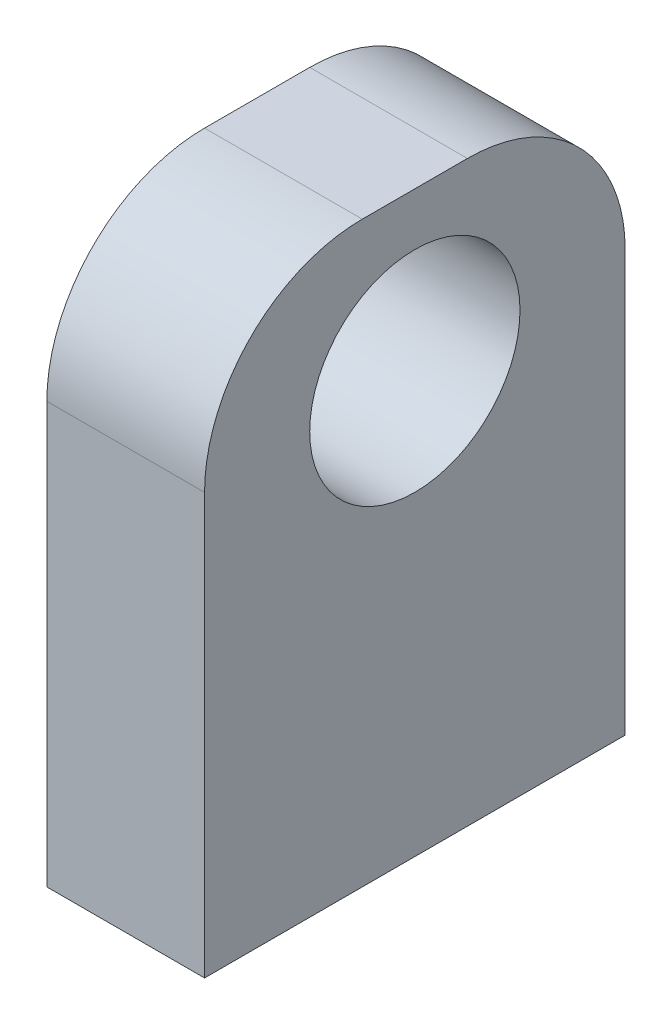
ISO-10303-21;
HEADER;
FILE_DESCRIPTION(('STEP AP214'),'2;1');
FILE_NAME('part.step','',(''),(''),'','','');
FILE_SCHEMA(('AUTOMOTIVE_DESIGN { 1 0 10303 214 1 1 1 1 }'));
ENDSEC;
DATA;
#1=APPLICATION_CONTEXT('core data for automotive mechanical design processes');
#2=APPLICATION_PROTOCOL_DEFINITION('international standard','automotive_design',2000,#1);
#3=PRODUCT_CONTEXT('',#1,'mechanical');
#4=PRODUCT('Part','Part','',(#3));
#5=PRODUCT_RELATED_PRODUCT_CATEGORY('part','',(#4));
#6=PRODUCT_DEFINITION_FORMATION('','',#4);
#7=PRODUCT_DEFINITION_CONTEXT('part definition',#1,'design');
#8=PRODUCT_DEFINITION('design','',#6,#7);
#9=PRODUCT_DEFINITION_SHAPE('','',#8);
#10=(LENGTH_UNIT() NAMED_UNIT(*) SI_UNIT(.MILLI.,.METRE.));
#11=(NAMED_UNIT(*) PLANE_ANGLE_UNIT() SI_UNIT($,.RADIAN.));
#12=(NAMED_UNIT(*) SI_UNIT($,.STERADIAN.) SOLID_ANGLE_UNIT());
#13=UNCERTAINTY_MEASURE_WITH_UNIT(LENGTH_MEASURE(1.E-05),#10,'distance_accuracy_value','');
#14=(GEOMETRIC_REPRESENTATION_CONTEXT(3) GLOBAL_UNCERTAINTY_ASSIGNED_CONTEXT((#13)) GLOBAL_UNIT_ASSIGNED_CONTEXT((#10,
#11,#12)) REPRESENTATION_CONTEXT('',''));
#15=CARTESIAN_POINT('',(0.,0.,0.));
#16=DIRECTION('',(0.,0.,1.));
#17=DIRECTION('',(1.,0.,0.));
#18=AXIS2_PLACEMENT_3D('',#15,#16,#17);
#19=CARTESIAN_POINT('',(10.,20.,-31.));
#20=DIRECTION('',(0.,0.,1.));
#21=DIRECTION('',(1.,0.,0.));
#22=AXIS2_PLACEMENT_3D('',#19,#20,#21);
#23=PLANE('',#22);
#24=DIRECTION('',(0.,-1.,0.));
#25=VECTOR('',#24,1.);
#26=CARTESIAN_POINT('',(10.,20.,-31.));
#27=LINE('',#26,#25);
#28=CARTESIAN_POINT('',(10.,14.,-31.));
#29=VERTEX_POINT('',#28);
#30=CARTESIAN_POINT('',(10.,-2.,-31.));
#31=VERTEX_POINT('',#30);
#32=EDGE_CURVE('E99',#29,#31,#27,.T.);
#33=ORIENTED_EDGE('',*,*,#32,.F.);
#34=DIRECTION('',(-1.,0.,0.));
#35=VECTOR('',#34,1.);
#36=CARTESIAN_POINT('',(16.,14.,-31.));
#37=LINE('',#36,#35);
#38=CARTESIAN_POINT('',(16.,14.,-31.));
#39=VERTEX_POINT('',#38);
#40=EDGE_CURVE('E70',#29,#39,#37,.F.);
#41=ORIENTED_EDGE('',*,*,#40,.T.);
#42=DIRECTION('',(0.,-1.,0.));
#43=VECTOR('',#42,1.);
#44=CARTESIAN_POINT('',(16.,20.,-31.));
#45=LINE('',#44,#43);
#46=CARTESIAN_POINT('',(16.,-2.,-31.));
#47=VERTEX_POINT('',#46);
#48=EDGE_CURVE('E109',#39,#47,#45,.T.);
#49=ORIENTED_EDGE('',*,*,#48,.T.);
#50=DIRECTION('',(1.,0.,0.));
#51=VECTOR('',#50,1.);
#52=CARTESIAN_POINT('',(10.,-2.,-31.));
#53=LINE('',#52,#51);
#54=EDGE_CURVE('E112',#31,#47,#53,.T.);
#55=ORIENTED_EDGE('',*,*,#54,.F.);
#56=EDGE_LOOP('',(#33,#41,#49,#55));
#57=FACE_BOUND('',#56,.T.);
#58=ADVANCED_FACE('F46',(#57),#23,.F.);
#59=CARTESIAN_POINT('',(110.,14.,-23.));
#60=DIRECTION('',(-1.,0.,0.));
#61=DIRECTION('',(0.,0.,1.));
#62=AXIS2_PLACEMENT_3D('',#59,#60,#61);
#63=CYLINDRICAL_SURFACE('',#62,4.);
#64=CARTESIAN_POINT('',(10.,14.,-23.));
#65=DIRECTION('',(-1.,0.,0.));
#66=DIRECTION('',(0.,0.,1.));
#67=AXIS2_PLACEMENT_3D('',#64,#65,#66);
#68=CIRCLE('',#67,4.);
#69=CARTESIAN_POINT('',(10.,14.,-19.));
#70=VERTEX_POINT('',#69);
#71=EDGE_CURVE('E146',#70,#70,#68,.T.);
#72=ORIENTED_EDGE('',*,*,#71,.T.);
#73=EDGE_LOOP('',(#72));
#74=FACE_BOUND('',#73,.T.);
#75=CARTESIAN_POINT('',(16.,14.,-23.));
#76=DIRECTION('',(-1.,0.,0.));
#77=DIRECTION('',(0.,0.,1.));
#78=AXIS2_PLACEMENT_3D('',#75,#76,#77);
#79=CIRCLE('',#78,4.);
#80=CARTESIAN_POINT('',(16.,14.,-19.));
#81=VERTEX_POINT('',#80);
#82=EDGE_CURVE('E142',#81,#81,#79,.T.);
#83=ORIENTED_EDGE('',*,*,#82,.F.);
#84=EDGE_LOOP('',(#83));
#85=FACE_BOUND('',#84,.T.);
#86=ADVANCED_FACE('F187',(#74,#85),#63,.F.);
#87=CARTESIAN_POINT('',(10.,20.,-31.));
#88=DIRECTION('',(1.,0.,0.));
#89=DIRECTION('',(0.,0.,-1.));
#90=AXIS2_PLACEMENT_3D('',#87,#88,#89);
#91=PLANE('',#90);
#92=ORIENTED_EDGE('',*,*,#71,.F.);
#93=EDGE_LOOP('',(#92));
#94=FACE_BOUND('',#93,.T.);
#95=DIRECTION('',(0.,0.,1.));
#96=VECTOR('',#95,1.);
#97=CARTESIAN_POINT('',(10.,20.,-31.));
#98=LINE('',#97,#96);
#99=CARTESIAN_POINT('',(10.,20.,-25.));
#100=VERTEX_POINT('',#99);
#101=CARTESIAN_POINT('',(10.,20.,-21.));
#102=VERTEX_POINT('',#101);
#103=EDGE_CURVE('E137',#100,#102,#98,.T.);
#104=ORIENTED_EDGE('',*,*,#103,.F.);
#105=CARTESIAN_POINT('',(10.,14.,-25.));
#106=DIRECTION('',(1.,0.,0.));
#107=DIRECTION('',(0.,0.,-1.));
#108=AXIS2_PLACEMENT_3D('',#105,#106,#107);
#109=CIRCLE('',#108,6.);
#110=EDGE_CURVE('E106',#100,#29,#109,.F.);
#111=ORIENTED_EDGE('',*,*,#110,.T.);
#112=ORIENTED_EDGE('',*,*,#32,.T.);
#113=DIRECTION('',(0.,0.,-1.));
#114=VECTOR('',#113,1.);
#115=CARTESIAN_POINT('',(10.,-2.,-15.));
#116=LINE('',#115,#114);
#117=CARTESIAN_POINT('',(10.,-2.,-15.));
#118=VERTEX_POINT('',#117);
#119=EDGE_CURVE('E105',#118,#31,#116,.T.);
#120=ORIENTED_EDGE('',*,*,#119,.F.);
#121=DIRECTION('',(0.,-1.,0.));
#122=VECTOR('',#121,1.);
#123=CARTESIAN_POINT('',(10.,20.,-15.));
#124=LINE('',#123,#122);
#125=CARTESIAN_POINT('',(10.,14.,-15.));
#126=VERTEX_POINT('',#125);
#127=EDGE_CURVE('E289',#126,#118,#124,.T.);
#128=ORIENTED_EDGE('',*,*,#127,.F.);
#129=CARTESIAN_POINT('',(10.,14.,-21.));
#130=DIRECTION('',(1.,0.,0.));
#131=DIRECTION('',(0.,0.,-1.));
#132=AXIS2_PLACEMENT_3D('',#129,#130,#131);
#133=CIRCLE('',#132,6.);
#134=EDGE_CURVE('E159',#126,#102,#133,.F.);
#135=ORIENTED_EDGE('',*,*,#134,.T.);
#136=EDGE_LOOP('',(#104,#111,#112,#120,#128,#135));
#137=FACE_BOUND('',#136,.T.);
#138=ADVANCED_FACE('F102',(#94,#137),#91,.F.);
#139=CARTESIAN_POINT('',(0.,20.,0.));
#140=DIRECTION('',(0.,1.,0.));
#141=DIRECTION('',(0.,0.,1.));
#142=AXIS2_PLACEMENT_3D('',#139,#140,#141);
#143=PLANE('',#142);
#144=DIRECTION('',(0.,0.,-1.));
#145=VECTOR('',#144,1.);
#146=CARTESIAN_POINT('',(16.,20.,-31.));
#147=LINE('',#146,#145);
#148=CARTESIAN_POINT('',(16.,20.,-21.));
#149=VERTEX_POINT('',#148);
#150=CARTESIAN_POINT('',(16.,20.,-25.));
#151=VERTEX_POINT('',#150);
#152=EDGE_CURVE('E108',#149,#151,#147,.T.);
#153=ORIENTED_EDGE('',*,*,#152,.T.);
#154=DIRECTION('',(-1.,0.,0.));
#155=VECTOR('',#154,1.);
#156=CARTESIAN_POINT('',(10.,20.,-25.));
#157=LINE('',#156,#155);
#158=EDGE_CURVE('E155',#151,#100,#157,.T.);
#159=ORIENTED_EDGE('',*,*,#158,.T.);
#160=ORIENTED_EDGE('',*,*,#103,.T.);
#161=DIRECTION('',(1.,0.,0.));
#162=VECTOR('',#161,1.);
#163=CARTESIAN_POINT('',(16.,20.,-21.));
#164=LINE('',#163,#162);
#165=EDGE_CURVE('E151',#102,#149,#164,.T.);
#166=ORIENTED_EDGE('',*,*,#165,.T.);
#167=EDGE_LOOP('',(#153,#159,#160,#166));
#168=FACE_BOUND('',#167,.T.);
#169=ADVANCED_FACE('F173',(#168),#143,.T.);
#170=CARTESIAN_POINT('',(16.,20.,-31.));
#171=DIRECTION('',(-1.,0.,0.));
#172=DIRECTION('',(0.,0.,1.));
#173=AXIS2_PLACEMENT_3D('',#170,#171,#172);
#174=PLANE('',#173);
#175=ORIENTED_EDGE('',*,*,#82,.T.);
#176=EDGE_LOOP('',(#175));
#177=FACE_BOUND('',#176,.T.);
#178=ORIENTED_EDGE('',*,*,#48,.F.);
#179=CARTESIAN_POINT('',(16.,14.,-25.));
#180=DIRECTION('',(-1.,0.,0.));
#181=DIRECTION('',(0.,0.,1.));
#182=AXIS2_PLACEMENT_3D('',#179,#180,#181);
#183=CIRCLE('',#182,6.);
#184=EDGE_CURVE('E55',#39,#151,#183,.F.);
#185=ORIENTED_EDGE('',*,*,#184,.T.);
#186=ORIENTED_EDGE('',*,*,#152,.F.);
#187=CARTESIAN_POINT('',(16.,14.,-21.));
#188=DIRECTION('',(-1.,0.,0.));
#189=DIRECTION('',(0.,0.,1.));
#190=AXIS2_PLACEMENT_3D('',#187,#188,#189);
#191=CIRCLE('',#190,6.);
#192=CARTESIAN_POINT('',(16.,14.,-15.));
#193=VERTEX_POINT('',#192);
#194=EDGE_CURVE('E62',#149,#193,#191,.F.);
#195=ORIENTED_EDGE('',*,*,#194,.T.);
#196=DIRECTION('',(0.,-1.,0.));
#197=VECTOR('',#196,1.);
#198=CARTESIAN_POINT('',(16.,20.,-15.));
#199=LINE('',#198,#197);
#200=CARTESIAN_POINT('',(16.,-2.,-15.));
#201=VERTEX_POINT('',#200);
#202=EDGE_CURVE('E286',#193,#201,#199,.T.);
#203=ORIENTED_EDGE('',*,*,#202,.T.);
#204=DIRECTION('',(0.,0.,1.));
#205=VECTOR('',#204,1.);
#206=CARTESIAN_POINT('',(16.,-2.,-15.));
#207=LINE('',#206,#205);
#208=EDGE_CURVE('E117',#47,#201,#207,.T.);
#209=ORIENTED_EDGE('',*,*,#208,.F.);
#210=EDGE_LOOP('',(#178,#185,#186,#195,#203,#209));
#211=FACE_BOUND('',#210,.T.);
#212=ADVANCED_FACE('F169',(#177,#211),#174,.F.);
#213=CARTESIAN_POINT('',(10.,20.,-15.));
#214=DIRECTION('',(0.,0.,-1.));
#215=DIRECTION('',(-1.,0.,0.));
#216=AXIS2_PLACEMENT_3D('',#213,#214,#215);
#217=PLANE('',#216);
#218=ORIENTED_EDGE('',*,*,#202,.F.);
#219=DIRECTION('',(1.,0.,0.));
#220=VECTOR('',#219,1.);
#221=CARTESIAN_POINT('',(10.,14.,-15.));
#222=LINE('',#221,#220);
#223=EDGE_CURVE('E12',#193,#126,#222,.F.);
#224=ORIENTED_EDGE('',*,*,#223,.T.);
#225=ORIENTED_EDGE('',*,*,#127,.T.);
#226=DIRECTION('',(-1.,0.,0.));
#227=VECTOR('',#226,1.);
#228=CARTESIAN_POINT('',(10.,-2.,-15.));
#229=LINE('',#228,#227);
#230=EDGE_CURVE('E122',#201,#118,#229,.T.);
#231=ORIENTED_EDGE('',*,*,#230,.F.);
#232=EDGE_LOOP('',(#218,#224,#225,#231));
#233=FACE_BOUND('',#232,.T.);
#234=ADVANCED_FACE('F177',(#233),#217,.F.);
#235=CARTESIAN_POINT('',(0.,14.,-25.));
#236=DIRECTION('',(1.,0.,0.));
#237=DIRECTION('',(0.,0.,-1.));
#238=AXIS2_PLACEMENT_3D('',#235,#236,#237);
#239=CYLINDRICAL_SURFACE('',#238,6.);
#240=ORIENTED_EDGE('',*,*,#184,.F.);
#241=ORIENTED_EDGE('',*,*,#40,.F.);
#242=ORIENTED_EDGE('',*,*,#110,.F.);
#243=ORIENTED_EDGE('',*,*,#158,.F.);
#244=EDGE_LOOP('',(#240,#241,#242,#243));
#245=FACE_BOUND('',#244,.T.);
#246=ADVANCED_FACE('F175',(#245),#239,.T.);
#247=CARTESIAN_POINT('',(0.,14.,-21.));
#248=DIRECTION('',(-1.,0.,0.));
#249=DIRECTION('',(0.,0.,1.));
#250=AXIS2_PLACEMENT_3D('',#247,#248,#249);
#251=CYLINDRICAL_SURFACE('',#250,6.);
#252=ORIENTED_EDGE('',*,*,#134,.F.);
#253=ORIENTED_EDGE('',*,*,#223,.F.);
#254=ORIENTED_EDGE('',*,*,#194,.F.);
#255=ORIENTED_EDGE('',*,*,#165,.F.);
#256=EDGE_LOOP('',(#252,#253,#254,#255));
#257=FACE_BOUND('',#256,.T.);
#258=ADVANCED_FACE('F48',(#257),#251,.T.);
#259=CARTESIAN_POINT('',(0.,-2.,0.));
#260=DIRECTION('',(0.,-1.,0.));
#261=DIRECTION('',(0.,0.,-1.));
#262=AXIS2_PLACEMENT_3D('',#259,#260,#261);
#263=PLANE('',#262);
#264=ORIENTED_EDGE('',*,*,#119,.T.);
#265=ORIENTED_EDGE('',*,*,#54,.T.);
#266=ORIENTED_EDGE('',*,*,#208,.T.);
#267=ORIENTED_EDGE('',*,*,#230,.T.);
#268=EDGE_LOOP('',(#264,#265,#266,#267));
#269=FACE_BOUND('',#268,.T.);
#270=ADVANCED_FACE('F120',(#269),#263,.T.);
#271=CLOSED_SHELL('',(#58,#86,#138,#169,#212,#234,#246,#258,#270));
#272=MANIFOLD_SOLID_BREP('B2',#271);
#273=ADVANCED_BREP_SHAPE_REPRESENTATION('',(#18,#272),#14);
#274=SHAPE_DEFINITION_REPRESENTATION(#9,#273);
ENDSEC;
END-ISO-10303-21;
